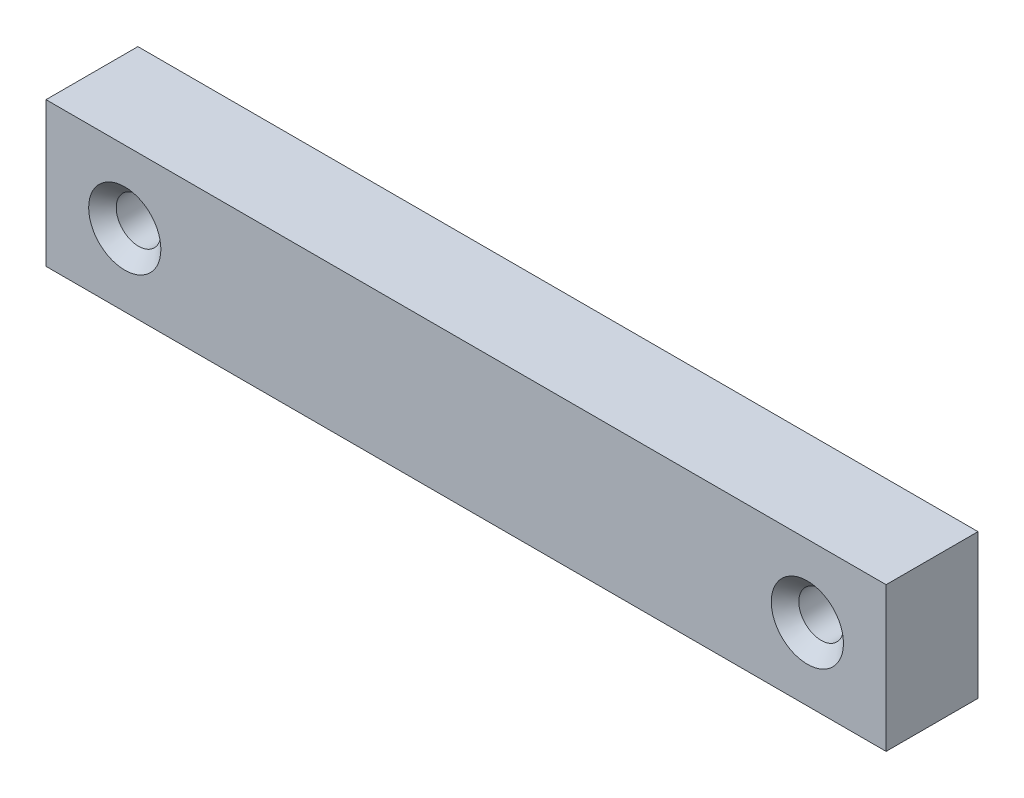
ISO-10303-21;
HEADER;
FILE_DESCRIPTION(('STEP AP214'),'2;1');
FILE_NAME('part.step','',(''),(''),'','','');
FILE_SCHEMA(('AUTOMOTIVE_DESIGN { 1 0 10303 214 1 1 1 1 }'));
ENDSEC;
DATA;
#1=APPLICATION_CONTEXT('core data for automotive mechanical design processes');
#2=APPLICATION_PROTOCOL_DEFINITION('international standard','automotive_design',2000,#1);
#3=PRODUCT_CONTEXT('',#1,'mechanical');
#4=PRODUCT('Part','Part','',(#3));
#5=PRODUCT_RELATED_PRODUCT_CATEGORY('part','',(#4));
#6=PRODUCT_DEFINITION_FORMATION('','',#4);
#7=PRODUCT_DEFINITION_CONTEXT('part definition',#1,'design');
#8=PRODUCT_DEFINITION('design','',#6,#7);
#9=PRODUCT_DEFINITION_SHAPE('','',#8);
#10=(LENGTH_UNIT() NAMED_UNIT(*) SI_UNIT(.MILLI.,.METRE.));
#11=(NAMED_UNIT(*) PLANE_ANGLE_UNIT() SI_UNIT($,.RADIAN.));
#12=(NAMED_UNIT(*) SI_UNIT($,.STERADIAN.) SOLID_ANGLE_UNIT());
#13=UNCERTAINTY_MEASURE_WITH_UNIT(LENGTH_MEASURE(1.E-05),#10,'distance_accuracy_value','');
#14=(GEOMETRIC_REPRESENTATION_CONTEXT(3) GLOBAL_UNCERTAINTY_ASSIGNED_CONTEXT((#13)) GLOBAL_UNIT_ASSIGNED_CONTEXT((#10,
#11,#12)) REPRESENTATION_CONTEXT('',''));
#15=CARTESIAN_POINT('',(0.,0.,0.));
#16=DIRECTION('',(0.,0.,1.));
#17=DIRECTION('',(1.,0.,0.));
#18=AXIS2_PLACEMENT_3D('',#15,#16,#17);
#19=CARTESIAN_POINT('',(58.,5.5,-7.));
#20=DIRECTION('',(0.,0.,1.));
#21=DIRECTION('',(1.,0.,0.));
#22=AXIS2_PLACEMENT_3D('',#19,#20,#21);
#23=CYLINDRICAL_SURFACE('',#22,1.7);
#24=CARTESIAN_POINT('',(58.,5.5,-7.));
#25=DIRECTION('',(0.,0.,1.));
#26=DIRECTION('',(1.,0.,0.));
#27=AXIS2_PLACEMENT_3D('',#24,#25,#26);
#28=CIRCLE('',#27,1.7);
#29=CARTESIAN_POINT('',(59.7,5.5,-7.));
#30=VERTEX_POINT('',#29);
#31=EDGE_CURVE('E117',#30,#30,#28,.T.);
#32=ORIENTED_EDGE('',*,*,#31,.F.);
#33=EDGE_LOOP('',(#32));
#34=FACE_BOUND('',#33,.T.);
#35=CARTESIAN_POINT('',(58.,5.5,-1.05000000000001));
#36=DIRECTION('',(0.,0.,1.));
#37=DIRECTION('',(1.,0.,0.));
#38=AXIS2_PLACEMENT_3D('',#35,#36,#37);
#39=CIRCLE('',#38,1.7);
#40=CARTESIAN_POINT('',(59.7,5.5,-1.05000000000001));
#41=VERTEX_POINT('',#40);
#42=EDGE_CURVE('E41',#41,#41,#39,.F.);
#43=ORIENTED_EDGE('',*,*,#42,.F.);
#44=EDGE_LOOP('',(#43));
#45=FACE_BOUND('',#44,.T.);
#46=ADVANCED_FACE('F37',(#34,#45),#23,.F.);
#47=CARTESIAN_POINT('',(6.,5.5,-7.));
#48=DIRECTION('',(0.,0.,1.));
#49=DIRECTION('',(1.,0.,0.));
#50=AXIS2_PLACEMENT_3D('',#47,#48,#49);
#51=CYLINDRICAL_SURFACE('',#50,1.7);
#52=CARTESIAN_POINT('',(6.,5.5,-7.));
#53=DIRECTION('',(0.,0.,1.));
#54=DIRECTION('',(1.,0.,0.));
#55=AXIS2_PLACEMENT_3D('',#52,#53,#54);
#56=CIRCLE('',#55,1.7);
#57=CARTESIAN_POINT('',(7.7,5.5,-7.));
#58=VERTEX_POINT('',#57);
#59=EDGE_CURVE('E109',#58,#58,#56,.T.);
#60=ORIENTED_EDGE('',*,*,#59,.F.);
#61=EDGE_LOOP('',(#60));
#62=FACE_BOUND('',#61,.T.);
#63=CARTESIAN_POINT('',(6.,5.5,-1.05000000000001));
#64=DIRECTION('',(0.,0.,1.));
#65=DIRECTION('',(1.,0.,0.));
#66=AXIS2_PLACEMENT_3D('',#63,#64,#65);
#67=CIRCLE('',#66,1.7);
#68=CARTESIAN_POINT('',(7.7,5.5,-1.05000000000001));
#69=VERTEX_POINT('',#68);
#70=EDGE_CURVE('E115',#69,#69,#67,.F.);
#71=ORIENTED_EDGE('',*,*,#70,.F.);
#72=EDGE_LOOP('',(#71));
#73=FACE_BOUND('',#72,.T.);
#74=ADVANCED_FACE('F135',(#62,#73),#51,.F.);
#75=CARTESIAN_POINT('',(0.,0.,-7.));
#76=DIRECTION('',(-1.,0.,0.));
#77=DIRECTION('',(0.,0.,1.));
#78=AXIS2_PLACEMENT_3D('',#75,#76,#77);
#79=PLANE('',#78);
#80=DIRECTION('',(0.,-1.,0.));
#81=VECTOR('',#80,1.);
#82=CARTESIAN_POINT('',(0.,0.,0.));
#83=LINE('',#82,#81);
#84=CARTESIAN_POINT('',(0.,11.,0.));
#85=VERTEX_POINT('',#84);
#86=CARTESIAN_POINT('',(0.,0.,0.));
#87=VERTEX_POINT('',#86);
#88=EDGE_CURVE('E105',#85,#87,#83,.T.);
#89=ORIENTED_EDGE('',*,*,#88,.F.);
#90=DIRECTION('',(0.,0.,1.));
#91=VECTOR('',#90,1.);
#92=CARTESIAN_POINT('',(0.,11.,-7.));
#93=LINE('',#92,#91);
#94=CARTESIAN_POINT('',(0.,11.,-7.));
#95=VERTEX_POINT('',#94);
#96=EDGE_CURVE('E11',#95,#85,#93,.T.);
#97=ORIENTED_EDGE('',*,*,#96,.F.);
#98=DIRECTION('',(0.,-1.,0.));
#99=VECTOR('',#98,1.);
#100=CARTESIAN_POINT('',(0.,0.,-7.));
#101=LINE('',#100,#99);
#102=CARTESIAN_POINT('',(0.,0.,-7.));
#103=VERTEX_POINT('',#102);
#104=EDGE_CURVE('E98',#95,#103,#101,.T.);
#105=ORIENTED_EDGE('',*,*,#104,.T.);
#106=DIRECTION('',(0.,0.,1.));
#107=VECTOR('',#106,1.);
#108=CARTESIAN_POINT('',(0.,0.,-7.));
#109=LINE('',#108,#107);
#110=EDGE_CURVE('E81',#103,#87,#109,.T.);
#111=ORIENTED_EDGE('',*,*,#110,.T.);
#112=EDGE_LOOP('',(#89,#97,#105,#111));
#113=FACE_BOUND('',#112,.T.);
#114=ADVANCED_FACE('F39',(#113),#79,.T.);
#115=CARTESIAN_POINT('',(0.,11.,-7.));
#116=DIRECTION('',(0.,1.,0.));
#117=DIRECTION('',(-1.,0.,0.));
#118=AXIS2_PLACEMENT_3D('',#115,#116,#117);
#119=PLANE('',#118);
#120=DIRECTION('',(-1.,0.,0.));
#121=VECTOR('',#120,1.);
#122=CARTESIAN_POINT('',(0.,11.,0.));
#123=LINE('',#122,#121);
#124=CARTESIAN_POINT('',(64.,11.,0.));
#125=VERTEX_POINT('',#124);
#126=EDGE_CURVE('E100',#125,#85,#123,.T.);
#127=ORIENTED_EDGE('',*,*,#126,.F.);
#128=DIRECTION('',(0.,0.,1.));
#129=VECTOR('',#128,1.);
#130=CARTESIAN_POINT('',(64.,11.,-7.));
#131=LINE('',#130,#129);
#132=CARTESIAN_POINT('',(64.,11.,-7.));
#133=VERTEX_POINT('',#132);
#134=EDGE_CURVE('E47',#133,#125,#131,.T.);
#135=ORIENTED_EDGE('',*,*,#134,.F.);
#136=DIRECTION('',(-1.,0.,0.));
#137=VECTOR('',#136,1.);
#138=CARTESIAN_POINT('',(0.,11.,-7.));
#139=LINE('',#138,#137);
#140=EDGE_CURVE('E95',#133,#95,#139,.T.);
#141=ORIENTED_EDGE('',*,*,#140,.T.);
#142=ORIENTED_EDGE('',*,*,#96,.T.);
#143=EDGE_LOOP('',(#127,#135,#141,#142));
#144=FACE_BOUND('',#143,.T.);
#145=ADVANCED_FACE('F143',(#144),#119,.T.);
#146=CARTESIAN_POINT('',(64.,0.,-7.));
#147=DIRECTION('',(1.,0.,0.));
#148=DIRECTION('',(0.,0.,-1.));
#149=AXIS2_PLACEMENT_3D('',#146,#147,#148);
#150=PLANE('',#149);
#151=DIRECTION('',(0.,1.,0.));
#152=VECTOR('',#151,1.);
#153=CARTESIAN_POINT('',(64.,0.,0.));
#154=LINE('',#153,#152);
#155=CARTESIAN_POINT('',(64.,0.,0.));
#156=VERTEX_POINT('',#155);
#157=EDGE_CURVE('E89',#156,#125,#154,.T.);
#158=ORIENTED_EDGE('',*,*,#157,.F.);
#159=DIRECTION('',(0.,0.,1.));
#160=VECTOR('',#159,1.);
#161=CARTESIAN_POINT('',(64.,0.,-7.));
#162=LINE('',#161,#160);
#163=CARTESIAN_POINT('',(64.,0.,-7.));
#164=VERTEX_POINT('',#163);
#165=EDGE_CURVE('E84',#164,#156,#162,.T.);
#166=ORIENTED_EDGE('',*,*,#165,.F.);
#167=DIRECTION('',(0.,1.,0.));
#168=VECTOR('',#167,1.);
#169=CARTESIAN_POINT('',(64.,0.,-7.));
#170=LINE('',#169,#168);
#171=EDGE_CURVE('E87',#164,#133,#170,.T.);
#172=ORIENTED_EDGE('',*,*,#171,.T.);
#173=ORIENTED_EDGE('',*,*,#134,.T.);
#174=EDGE_LOOP('',(#158,#166,#172,#173));
#175=FACE_BOUND('',#174,.T.);
#176=ADVANCED_FACE('F86',(#175),#150,.T.);
#177=CARTESIAN_POINT('',(0.,0.,-7.));
#178=DIRECTION('',(0.,-1.,0.));
#179=DIRECTION('',(0.,0.,-1.));
#180=AXIS2_PLACEMENT_3D('',#177,#178,#179);
#181=PLANE('',#180);
#182=DIRECTION('',(1.,0.,0.));
#183=VECTOR('',#182,1.);
#184=CARTESIAN_POINT('',(0.,0.,0.));
#185=LINE('',#184,#183);
#186=EDGE_CURVE('E108',#87,#156,#185,.T.);
#187=ORIENTED_EDGE('',*,*,#186,.F.);
#188=ORIENTED_EDGE('',*,*,#110,.F.);
#189=DIRECTION('',(1.,0.,0.));
#190=VECTOR('',#189,1.);
#191=CARTESIAN_POINT('',(0.,0.,-7.));
#192=LINE('',#191,#190);
#193=EDGE_CURVE('E94',#103,#164,#192,.T.);
#194=ORIENTED_EDGE('',*,*,#193,.T.);
#195=ORIENTED_EDGE('',*,*,#165,.T.);
#196=EDGE_LOOP('',(#187,#188,#194,#195));
#197=FACE_BOUND('',#196,.T.);
#198=ADVANCED_FACE('F97',(#197),#181,.T.);
#199=CARTESIAN_POINT('',(0.,0.,-7.));
#200=DIRECTION('',(0.,0.,-1.));
#201=DIRECTION('',(-1.,0.,0.));
#202=AXIS2_PLACEMENT_3D('',#199,#200,#201);
#203=PLANE('',#202);
#204=ORIENTED_EDGE('',*,*,#59,.T.);
#205=EDGE_LOOP('',(#204));
#206=FACE_BOUND('',#205,.T.);
#207=ORIENTED_EDGE('',*,*,#31,.T.);
#208=EDGE_LOOP('',(#207));
#209=FACE_BOUND('',#208,.T.);
#210=ORIENTED_EDGE('',*,*,#104,.F.);
#211=ORIENTED_EDGE('',*,*,#140,.F.);
#212=ORIENTED_EDGE('',*,*,#171,.F.);
#213=ORIENTED_EDGE('',*,*,#193,.F.);
#214=EDGE_LOOP('',(#210,#211,#212,#213));
#215=FACE_BOUND('',#214,.T.);
#216=ADVANCED_FACE('F93',(#206,#209,#215),#203,.T.);
#217=CARTESIAN_POINT('',(0.,0.,0.));
#218=DIRECTION('',(0.,0.,-1.));
#219=DIRECTION('',(-1.,0.,0.));
#220=AXIS2_PLACEMENT_3D('',#217,#218,#219);
#221=PLANE('',#220);
#222=CARTESIAN_POINT('',(58.,5.5,0.));
#223=DIRECTION('',(0.,0.,1.));
#224=DIRECTION('',(1.,0.,0.));
#225=AXIS2_PLACEMENT_3D('',#222,#223,#224);
#226=CIRCLE('',#225,2.75);
#227=CARTESIAN_POINT('',(60.75,5.5,0.));
#228=VERTEX_POINT('',#227);
#229=EDGE_CURVE('E127',#228,#228,#226,.T.);
#230=ORIENTED_EDGE('',*,*,#229,.F.);
#231=EDGE_LOOP('',(#230));
#232=FACE_BOUND('',#231,.T.);
#233=CARTESIAN_POINT('',(6.,5.5,0.));
#234=DIRECTION('',(0.,0.,-1.));
#235=DIRECTION('',(-1.,0.,0.));
#236=AXIS2_PLACEMENT_3D('',#233,#234,#235);
#237=CIRCLE('',#236,2.75);
#238=CARTESIAN_POINT('',(3.25,5.5,0.));
#239=VERTEX_POINT('',#238);
#240=EDGE_CURVE('E118',#239,#239,#237,.T.);
#241=ORIENTED_EDGE('',*,*,#240,.T.);
#242=EDGE_LOOP('',(#241));
#243=FACE_BOUND('',#242,.T.);
#244=ORIENTED_EDGE('',*,*,#88,.T.);
#245=ORIENTED_EDGE('',*,*,#186,.T.);
#246=ORIENTED_EDGE('',*,*,#157,.T.);
#247=ORIENTED_EDGE('',*,*,#126,.T.);
#248=EDGE_LOOP('',(#244,#245,#246,#247));
#249=FACE_BOUND('',#248,.T.);
#250=ADVANCED_FACE('F152',(#232,#243,#249),#221,.F.);
#251=CARTESIAN_POINT('',(6.,5.5,0.));
#252=DIRECTION('',(0.,0.,1.));
#253=DIRECTION('',(1.,0.,0.));
#254=AXIS2_PLACEMENT_3D('',#251,#252,#253);
#255=CONICAL_SURFACE('',#254,2.75,0.785398163397443);
#256=ORIENTED_EDGE('',*,*,#240,.F.);
#257=EDGE_LOOP('',(#256));
#258=FACE_BOUND('',#257,.T.);
#259=ORIENTED_EDGE('',*,*,#70,.T.);
#260=EDGE_LOOP('',(#259));
#261=FACE_BOUND('',#260,.T.);
#262=ADVANCED_FACE('F147',(#258,#261),#255,.F.);
#263=CARTESIAN_POINT('',(58.,5.5,0.));
#264=DIRECTION('',(0.,0.,1.));
#265=DIRECTION('',(-1.,0.,0.));
#266=AXIS2_PLACEMENT_3D('',#263,#264,#265);
#267=CONICAL_SURFACE('',#266,2.75,0.785398163397443);
#268=ORIENTED_EDGE('',*,*,#229,.T.);
#269=EDGE_LOOP('',(#268));
#270=FACE_BOUND('',#269,.T.);
#271=ORIENTED_EDGE('',*,*,#42,.T.);
#272=EDGE_LOOP('',(#271));
#273=FACE_BOUND('',#272,.T.);
#274=ADVANCED_FACE('F180',(#270,#273),#267,.F.);
#275=CLOSED_SHELL('',(#46,#74,#114,#145,#176,#198,#216,#250,#262,#274));
#276=MANIFOLD_SOLID_BREP('B2',#275);
#277=ADVANCED_BREP_SHAPE_REPRESENTATION('',(#18,#276),#14);
#278=SHAPE_DEFINITION_REPRESENTATION(#9,#277);
ENDSEC;
END-ISO-10303-21;
